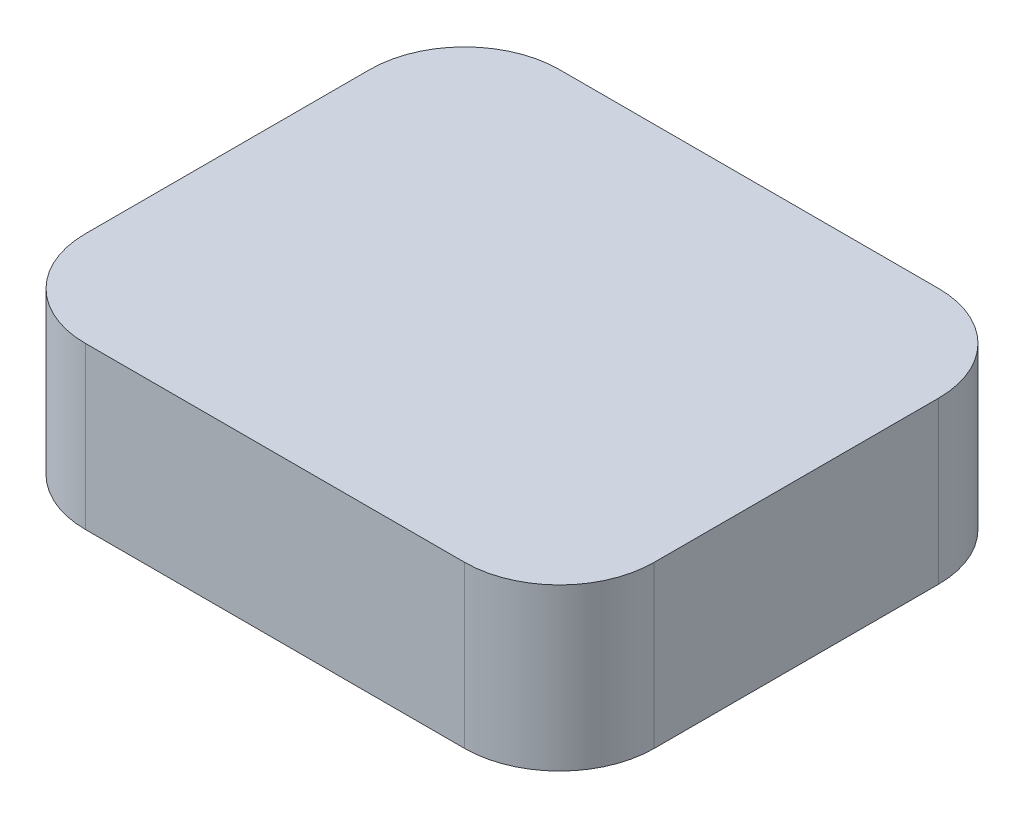
ISO-10303-21;
HEADER;
FILE_DESCRIPTION(('STEP AP214'),'2;1');
FILE_NAME('part.step','',(''),(''),'','','');
FILE_SCHEMA(('AUTOMOTIVE_DESIGN { 1 0 10303 214 1 1 1 1 }'));
ENDSEC;
DATA;
#1=APPLICATION_CONTEXT('core data for automotive mechanical design processes');
#2=APPLICATION_PROTOCOL_DEFINITION('international standard','automotive_design',2000,#1);
#3=PRODUCT_CONTEXT('',#1,'mechanical');
#4=PRODUCT('Part','Part','',(#3));
#5=PRODUCT_RELATED_PRODUCT_CATEGORY('part','',(#4));
#6=PRODUCT_DEFINITION_FORMATION('','',#4);
#7=PRODUCT_DEFINITION_CONTEXT('part definition',#1,'design');
#8=PRODUCT_DEFINITION('design','',#6,#7);
#9=PRODUCT_DEFINITION_SHAPE('','',#8);
#10=(LENGTH_UNIT() NAMED_UNIT(*) SI_UNIT(.MILLI.,.METRE.));
#11=(NAMED_UNIT(*) PLANE_ANGLE_UNIT() SI_UNIT($,.RADIAN.));
#12=(NAMED_UNIT(*) SI_UNIT($,.STERADIAN.) SOLID_ANGLE_UNIT());
#13=UNCERTAINTY_MEASURE_WITH_UNIT(LENGTH_MEASURE(1.E-05),#10,'distance_accuracy_value','');
#14=(GEOMETRIC_REPRESENTATION_CONTEXT(3) GLOBAL_UNCERTAINTY_ASSIGNED_CONTEXT((#13)) GLOBAL_UNIT_ASSIGNED_CONTEXT((#10,
#11,#12)) REPRESENTATION_CONTEXT('',''));
#15=CARTESIAN_POINT('',(0.,0.,0.));
#16=DIRECTION('',(0.,0.,1.));
#17=DIRECTION('',(1.,0.,0.));
#18=AXIS2_PLACEMENT_3D('',#15,#16,#17);
#19=CARTESIAN_POINT('',(-7.15383369720603,-16.2258305231151,4.44835605739227));
#20=DIRECTION('',(0.,1.,0.));
#21=DIRECTION('',(0.,0.,1.));
#22=AXIS2_PLACEMENT_3D('',#19,#20,#21);
#23=PLANE('',#22);
#24=DIRECTION('',(-1.,0.,0.));
#25=VECTOR('',#24,1.);
#26=CARTESIAN_POINT('',(-12.2052523703531,-16.2258305231151,20.9727386364569));
#27=LINE('',#26,#25);
#28=CARTESIAN_POINT('',(-12.2052523703531,-16.2258305231151,20.9727386364569));
#29=VERTEX_POINT('',#28);
#30=CARTESIAN_POINT('',(-22.3652523703531,-16.2258305231151,20.9727386364569));
#31=VERTEX_POINT('',#30);
#32=EDGE_CURVE('E126',#29,#31,#27,.T.);
#33=ORIENTED_EDGE('',*,*,#32,.T.);
#34=CARTESIAN_POINT('',(-22.3652523703531,-16.2258305231151,18.4327386364569));
#35=DIRECTION('',(0.,-1.,0.));
#36=DIRECTION('',(0.,0.,1.));
#37=AXIS2_PLACEMENT_3D('',#34,#35,#36);
#38=CIRCLE('',#37,2.54);
#39=CARTESIAN_POINT('',(-24.9052523703531,-16.2258305231151,18.4327386364569));
#40=VERTEX_POINT('',#39);
#41=EDGE_CURVE('E11',#31,#40,#38,.T.);
#42=ORIENTED_EDGE('',*,*,#41,.T.);
#43=DIRECTION('',(0.,0.,-1.));
#44=VECTOR('',#43,1.);
#45=CARTESIAN_POINT('',(-24.9052523703531,-16.2258305231151,10.8127386364569));
#46=LINE('',#45,#44);
#47=CARTESIAN_POINT('',(-24.9052523703531,-16.2258305231151,10.8127386364569));
#48=VERTEX_POINT('',#47);
#49=EDGE_CURVE('E56',#40,#48,#46,.T.);
#50=ORIENTED_EDGE('',*,*,#49,.T.);
#51=CARTESIAN_POINT('',(-22.365252370353,-16.2258305231151,10.8127386364569));
#52=DIRECTION('',(0.,-1.,0.));
#53=DIRECTION('',(0.,0.,-1.));
#54=AXIS2_PLACEMENT_3D('',#51,#52,#53);
#55=CIRCLE('',#54,2.54);
#56=CARTESIAN_POINT('',(-22.365252370353,-16.2258305231151,8.27273863645686));
#57=VERTEX_POINT('',#56);
#58=EDGE_CURVE('E179',#48,#57,#55,.T.);
#59=ORIENTED_EDGE('',*,*,#58,.T.);
#60=DIRECTION('',(1.,0.,0.));
#61=VECTOR('',#60,1.);
#62=CARTESIAN_POINT('',(-12.2052523703531,-16.2258305231151,8.27273863645686));
#63=LINE('',#62,#61);
#64=CARTESIAN_POINT('',(-12.2052523703531,-16.2258305231151,8.27273863645686));
#65=VERTEX_POINT('',#64);
#66=EDGE_CURVE('E183',#57,#65,#63,.T.);
#67=ORIENTED_EDGE('',*,*,#66,.T.);
#68=CARTESIAN_POINT('',(-12.2052523703531,-16.2258305231151,10.8127386364569));
#69=DIRECTION('',(0.,-1.,0.));
#70=DIRECTION('',(0.,0.,-1.));
#71=AXIS2_PLACEMENT_3D('',#68,#69,#70);
#72=CIRCLE('',#71,2.54);
#73=CARTESIAN_POINT('',(-9.66525237035306,-16.2258305231151,10.8127386364569));
#74=VERTEX_POINT('',#73);
#75=EDGE_CURVE('E190',#65,#74,#72,.T.);
#76=ORIENTED_EDGE('',*,*,#75,.T.);
#77=DIRECTION('',(0.,0.,1.));
#78=VECTOR('',#77,1.);
#79=CARTESIAN_POINT('',(-9.66525237035305,-16.2258305231151,10.8127386364569));
#80=LINE('',#79,#78);
#81=CARTESIAN_POINT('',(-9.66525237035306,-16.2258305231151,18.4327386364569));
#82=VERTEX_POINT('',#81);
#83=EDGE_CURVE('E194',#74,#82,#80,.T.);
#84=ORIENTED_EDGE('',*,*,#83,.T.);
#85=CARTESIAN_POINT('',(-12.2052523703531,-16.2258305231151,18.4327386364569));
#86=DIRECTION('',(0.,-1.,0.));
#87=DIRECTION('',(0.,0.,1.));
#88=AXIS2_PLACEMENT_3D('',#85,#86,#87);
#89=CIRCLE('',#88,2.54);
#90=EDGE_CURVE('E197',#82,#29,#89,.T.);
#91=ORIENTED_EDGE('',*,*,#90,.T.);
#92=EDGE_LOOP('',(#33,#42,#50,#59,#67,#76,#84,#91));
#93=FACE_BOUND('',#92,.T.);
#94=ADVANCED_FACE('F47',(#93),#23,.F.);
#95=CARTESIAN_POINT('',(-22.3652523703531,-16.2258305231151,18.4327386364569));
#96=DIRECTION('',(0.,1.,0.));
#97=DIRECTION('',(0.,0.,1.));
#98=AXIS2_PLACEMENT_3D('',#95,#96,#97);
#99=CYLINDRICAL_SURFACE('',#98,2.54);
#100=CARTESIAN_POINT('',(-22.3652523703531,-11.9078305231151,18.4327386364569));
#101=DIRECTION('',(0.,-1.,0.));
#102=DIRECTION('',(0.,0.,1.));
#103=AXIS2_PLACEMENT_3D('',#100,#101,#102);
#104=CIRCLE('',#103,2.54);
#105=CARTESIAN_POINT('',(-22.3652523703531,-11.9078305231151,20.9727386364569));
#106=VERTEX_POINT('',#105);
#107=CARTESIAN_POINT('',(-24.9052523703531,-11.9078305231151,18.4327386364569));
#108=VERTEX_POINT('',#107);
#109=EDGE_CURVE('E118',#106,#108,#104,.T.);
#110=ORIENTED_EDGE('',*,*,#109,.T.);
#111=DIRECTION('',(0.,1.,0.));
#112=VECTOR('',#111,1.);
#113=CARTESIAN_POINT('',(-24.9052523703531,-16.2258305231151,18.4327386364569));
#114=LINE('',#113,#112);
#115=EDGE_CURVE('E50',#40,#108,#114,.T.);
#116=ORIENTED_EDGE('',*,*,#115,.F.);
#117=ORIENTED_EDGE('',*,*,#41,.F.);
#118=DIRECTION('',(0.,1.,0.));
#119=VECTOR('',#118,1.);
#120=CARTESIAN_POINT('',(-22.3652523703531,-16.2258305231151,20.9727386364569));
#121=LINE('',#120,#119);
#122=EDGE_CURVE('E130',#31,#106,#121,.T.);
#123=ORIENTED_EDGE('',*,*,#122,.T.);
#124=EDGE_LOOP('',(#110,#116,#117,#123));
#125=FACE_BOUND('',#124,.T.);
#126=ADVANCED_FACE('F128',(#125),#99,.T.);
#127=CARTESIAN_POINT('',(-24.9052523703531,-16.2258305231151,10.8127386364569));
#128=DIRECTION('',(1.,0.,0.));
#129=DIRECTION('',(0.,0.,-1.));
#130=AXIS2_PLACEMENT_3D('',#127,#128,#129);
#131=PLANE('',#130);
#132=DIRECTION('',(0.,0.,-1.));
#133=VECTOR('',#132,1.);
#134=CARTESIAN_POINT('',(-24.9052523703531,-11.9078305231151,10.8127386364569));
#135=LINE('',#134,#133);
#136=CARTESIAN_POINT('',(-24.9052523703531,-11.9078305231151,10.8127386364569));
#137=VERTEX_POINT('',#136);
#138=EDGE_CURVE('E114',#108,#137,#135,.T.);
#139=ORIENTED_EDGE('',*,*,#138,.T.);
#140=DIRECTION('',(0.,1.,0.));
#141=VECTOR('',#140,1.);
#142=CARTESIAN_POINT('',(-24.9052523703531,-16.2258305231151,10.8127386364569));
#143=LINE('',#142,#141);
#144=EDGE_CURVE('E127',#48,#137,#143,.T.);
#145=ORIENTED_EDGE('',*,*,#144,.F.);
#146=ORIENTED_EDGE('',*,*,#49,.F.);
#147=ORIENTED_EDGE('',*,*,#115,.T.);
#148=EDGE_LOOP('',(#139,#145,#146,#147));
#149=FACE_BOUND('',#148,.T.);
#150=ADVANCED_FACE('F124',(#149),#131,.F.);
#151=CARTESIAN_POINT('',(-22.365252370353,-16.2258305231151,10.8127386364569));
#152=DIRECTION('',(0.,1.,0.));
#153=DIRECTION('',(0.,0.,1.));
#154=AXIS2_PLACEMENT_3D('',#151,#152,#153);
#155=CYLINDRICAL_SURFACE('',#154,2.54);
#156=CARTESIAN_POINT('',(-22.365252370353,-11.9078305231151,10.8127386364569));
#157=DIRECTION('',(0.,-1.,0.));
#158=DIRECTION('',(0.,0.,-1.));
#159=AXIS2_PLACEMENT_3D('',#156,#157,#158);
#160=CIRCLE('',#159,2.54);
#161=CARTESIAN_POINT('',(-22.365252370353,-11.9078305231151,8.27273863645686));
#162=VERTEX_POINT('',#161);
#163=EDGE_CURVE('E120',#137,#162,#160,.T.);
#164=ORIENTED_EDGE('',*,*,#163,.T.);
#165=DIRECTION('',(0.,1.,0.));
#166=VECTOR('',#165,1.);
#167=CARTESIAN_POINT('',(-22.365252370353,-16.2258305231151,8.27273863645686));
#168=LINE('',#167,#166);
#169=EDGE_CURVE('E171',#57,#162,#168,.T.);
#170=ORIENTED_EDGE('',*,*,#169,.F.);
#171=ORIENTED_EDGE('',*,*,#58,.F.);
#172=ORIENTED_EDGE('',*,*,#144,.T.);
#173=EDGE_LOOP('',(#164,#170,#171,#172));
#174=FACE_BOUND('',#173,.T.);
#175=ADVANCED_FACE('F176',(#174),#155,.T.);
#176=CARTESIAN_POINT('',(-12.2052523703531,-16.2258305231151,8.27273863645686));
#177=DIRECTION('',(0.,0.,1.));
#178=DIRECTION('',(1.,0.,0.));
#179=AXIS2_PLACEMENT_3D('',#176,#177,#178);
#180=PLANE('',#179);
#181=DIRECTION('',(1.,0.,0.));
#182=VECTOR('',#181,1.);
#183=CARTESIAN_POINT('',(-12.2052523703531,-11.9078305231151,8.27273863645686));
#184=LINE('',#183,#182);
#185=CARTESIAN_POINT('',(-12.2052523703531,-11.9078305231151,8.27273863645686));
#186=VERTEX_POINT('',#185);
#187=EDGE_CURVE('E138',#162,#186,#184,.T.);
#188=ORIENTED_EDGE('',*,*,#187,.T.);
#189=DIRECTION('',(0.,1.,0.));
#190=VECTOR('',#189,1.);
#191=CARTESIAN_POINT('',(-12.2052523703531,-16.2258305231151,8.27273863645686));
#192=LINE('',#191,#190);
#193=EDGE_CURVE('E167',#65,#186,#192,.T.);
#194=ORIENTED_EDGE('',*,*,#193,.F.);
#195=ORIENTED_EDGE('',*,*,#66,.F.);
#196=ORIENTED_EDGE('',*,*,#169,.T.);
#197=EDGE_LOOP('',(#188,#194,#195,#196));
#198=FACE_BOUND('',#197,.T.);
#199=ADVANCED_FACE('F217',(#198),#180,.F.);
#200=CARTESIAN_POINT('',(-12.2052523703531,-16.2258305231151,10.8127386364569));
#201=DIRECTION('',(0.,1.,0.));
#202=DIRECTION('',(0.,0.,1.));
#203=AXIS2_PLACEMENT_3D('',#200,#201,#202);
#204=CYLINDRICAL_SURFACE('',#203,2.54);
#205=CARTESIAN_POINT('',(-12.2052523703531,-11.9078305231151,10.8127386364569));
#206=DIRECTION('',(0.,-1.,0.));
#207=DIRECTION('',(0.,0.,-1.));
#208=AXIS2_PLACEMENT_3D('',#205,#206,#207);
#209=CIRCLE('',#208,2.54);
#210=CARTESIAN_POINT('',(-9.66525237035306,-11.9078305231151,10.8127386364569));
#211=VERTEX_POINT('',#210);
#212=EDGE_CURVE('E141',#186,#211,#209,.T.);
#213=ORIENTED_EDGE('',*,*,#212,.T.);
#214=DIRECTION('',(0.,1.,0.));
#215=VECTOR('',#214,1.);
#216=CARTESIAN_POINT('',(-9.66525237035306,-16.2258305231151,10.8127386364569));
#217=LINE('',#216,#215);
#218=EDGE_CURVE('E163',#74,#211,#217,.T.);
#219=ORIENTED_EDGE('',*,*,#218,.F.);
#220=ORIENTED_EDGE('',*,*,#75,.F.);
#221=ORIENTED_EDGE('',*,*,#193,.T.);
#222=EDGE_LOOP('',(#213,#219,#220,#221));
#223=FACE_BOUND('',#222,.T.);
#224=ADVANCED_FACE('F214',(#223),#204,.T.);
#225=CARTESIAN_POINT('',(-9.66525237035305,-16.2258305231151,10.8127386364569));
#226=DIRECTION('',(-1.,0.,0.));
#227=DIRECTION('',(0.,0.,1.));
#228=AXIS2_PLACEMENT_3D('',#225,#226,#227);
#229=PLANE('',#228);
#230=DIRECTION('',(0.,0.,1.));
#231=VECTOR('',#230,1.);
#232=CARTESIAN_POINT('',(-9.66525237035305,-11.9078305231151,10.8127386364569));
#233=LINE('',#232,#231);
#234=CARTESIAN_POINT('',(-9.66525237035306,-11.9078305231151,18.4327386364569));
#235=VERTEX_POINT('',#234);
#236=EDGE_CURVE('E144',#211,#235,#233,.T.);
#237=ORIENTED_EDGE('',*,*,#236,.T.);
#238=DIRECTION('',(0.,1.,0.));
#239=VECTOR('',#238,1.);
#240=CARTESIAN_POINT('',(-9.66525237035306,-16.2258305231151,18.4327386364569));
#241=LINE('',#240,#239);
#242=EDGE_CURVE('E159',#82,#235,#241,.T.);
#243=ORIENTED_EDGE('',*,*,#242,.F.);
#244=ORIENTED_EDGE('',*,*,#83,.F.);
#245=ORIENTED_EDGE('',*,*,#218,.T.);
#246=EDGE_LOOP('',(#237,#243,#244,#245));
#247=FACE_BOUND('',#246,.T.);
#248=ADVANCED_FACE('F211',(#247),#229,.F.);
#249=CARTESIAN_POINT('',(-12.2052523703531,-16.2258305231151,18.4327386364569));
#250=DIRECTION('',(0.,1.,0.));
#251=DIRECTION('',(0.,0.,1.));
#252=AXIS2_PLACEMENT_3D('',#249,#250,#251);
#253=CYLINDRICAL_SURFACE('',#252,2.54);
#254=CARTESIAN_POINT('',(-12.2052523703531,-11.9078305231151,18.4327386364569));
#255=DIRECTION('',(0.,-1.,0.));
#256=DIRECTION('',(0.,0.,1.));
#257=AXIS2_PLACEMENT_3D('',#254,#255,#256);
#258=CIRCLE('',#257,2.54);
#259=CARTESIAN_POINT('',(-12.2052523703531,-11.9078305231151,20.9727386364569));
#260=VERTEX_POINT('',#259);
#261=EDGE_CURVE('E147',#235,#260,#258,.T.);
#262=ORIENTED_EDGE('',*,*,#261,.T.);
#263=DIRECTION('',(0.,1.,0.));
#264=VECTOR('',#263,1.);
#265=CARTESIAN_POINT('',(-12.2052523703531,-16.2258305231151,20.9727386364569));
#266=LINE('',#265,#264);
#267=EDGE_CURVE('E155',#29,#260,#266,.T.);
#268=ORIENTED_EDGE('',*,*,#267,.F.);
#269=ORIENTED_EDGE('',*,*,#90,.F.);
#270=ORIENTED_EDGE('',*,*,#242,.T.);
#271=EDGE_LOOP('',(#262,#268,#269,#270));
#272=FACE_BOUND('',#271,.T.);
#273=ADVANCED_FACE('F208',(#272),#253,.T.);
#274=CARTESIAN_POINT('',(-12.2052523703531,-16.2258305231151,20.9727386364569));
#275=DIRECTION('',(0.,0.,-1.));
#276=DIRECTION('',(-1.,0.,0.));
#277=AXIS2_PLACEMENT_3D('',#274,#275,#276);
#278=PLANE('',#277);
#279=DIRECTION('',(-1.,0.,0.));
#280=VECTOR('',#279,1.);
#281=CARTESIAN_POINT('',(-12.2052523703531,-11.9078305231151,20.9727386364569));
#282=LINE('',#281,#280);
#283=EDGE_CURVE('E150',#260,#106,#282,.T.);
#284=ORIENTED_EDGE('',*,*,#283,.T.);
#285=ORIENTED_EDGE('',*,*,#122,.F.);
#286=ORIENTED_EDGE('',*,*,#32,.F.);
#287=ORIENTED_EDGE('',*,*,#267,.T.);
#288=EDGE_LOOP('',(#284,#285,#286,#287));
#289=FACE_BOUND('',#288,.T.);
#290=ADVANCED_FACE('F203',(#289),#278,.F.);
#291=CARTESIAN_POINT('',(-22.3652523703531,-11.9078305231151,18.4327386364569));
#292=DIRECTION('',(0.,1.,0.));
#293=DIRECTION('',(0.,0.,1.));
#294=AXIS2_PLACEMENT_3D('',#291,#292,#293);
#295=PLANE('',#294);
#296=ORIENTED_EDGE('',*,*,#109,.F.);
#297=ORIENTED_EDGE('',*,*,#283,.F.);
#298=ORIENTED_EDGE('',*,*,#261,.F.);
#299=ORIENTED_EDGE('',*,*,#236,.F.);
#300=ORIENTED_EDGE('',*,*,#212,.F.);
#301=ORIENTED_EDGE('',*,*,#187,.F.);
#302=ORIENTED_EDGE('',*,*,#163,.F.);
#303=ORIENTED_EDGE('',*,*,#138,.F.);
#304=EDGE_LOOP('',(#296,#297,#298,#299,#300,#301,#302,#303));
#305=FACE_BOUND('',#304,.T.);
#306=ADVANCED_FACE('F115',(#305),#295,.T.);
#307=CLOSED_SHELL('',(#94,#126,#150,#175,#199,#224,#248,#273,#290,#306));
#308=MANIFOLD_SOLID_BREP('B2',#307);
#309=ADVANCED_BREP_SHAPE_REPRESENTATION('',(#18,#308),#14);
#310=SHAPE_DEFINITION_REPRESENTATION(#9,#309);
ENDSEC;
END-ISO-10303-21;
